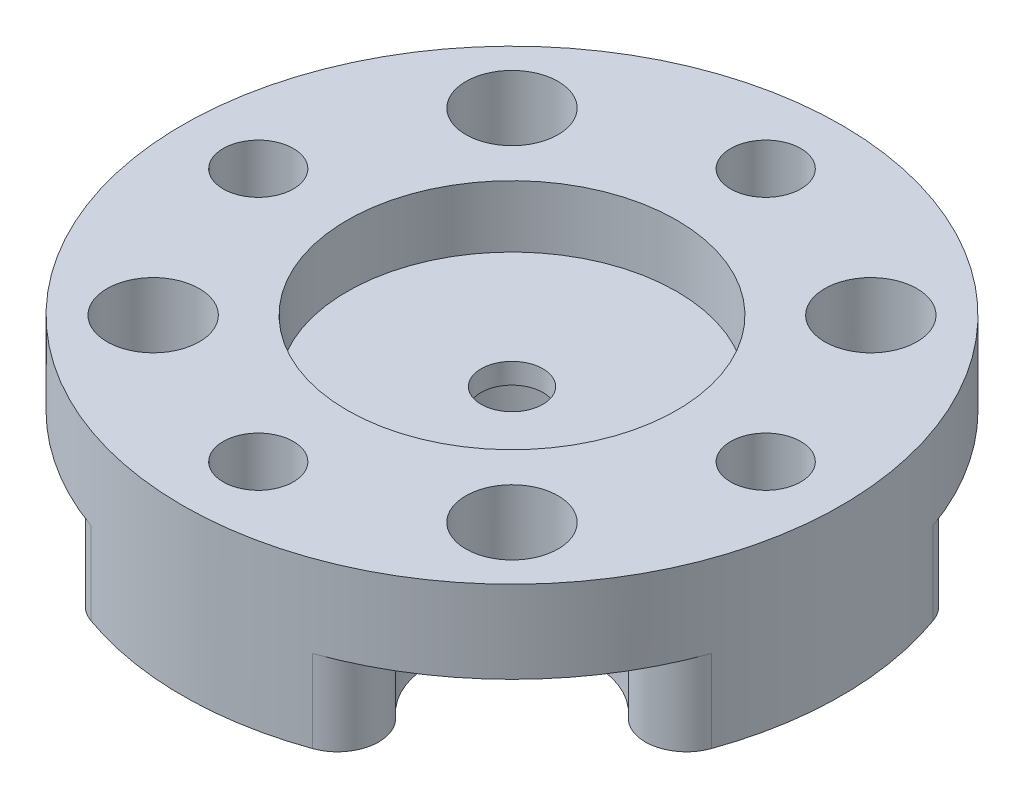
ISO-10303-21;
HEADER;
FILE_DESCRIPTION(('STEP AP214'),'2;1');
FILE_NAME('part.step','',(''),(''),'','','');
FILE_SCHEMA(('AUTOMOTIVE_DESIGN { 1 0 10303 214 1 1 1 1 }'));
ENDSEC;
DATA;
#1=APPLICATION_CONTEXT('core data for automotive mechanical design processes');
#2=APPLICATION_PROTOCOL_DEFINITION('international standard','automotive_design',2000,#1);
#3=PRODUCT_CONTEXT('',#1,'mechanical');
#4=PRODUCT('Part','Part','',(#3));
#5=PRODUCT_RELATED_PRODUCT_CATEGORY('part','',(#4));
#6=PRODUCT_DEFINITION_FORMATION('','',#4);
#7=PRODUCT_DEFINITION_CONTEXT('part definition',#1,'design');
#8=PRODUCT_DEFINITION('design','',#6,#7);
#9=PRODUCT_DEFINITION_SHAPE('','',#8);
#10=(LENGTH_UNIT() NAMED_UNIT(*) SI_UNIT(.MILLI.,.METRE.));
#11=(NAMED_UNIT(*) PLANE_ANGLE_UNIT() SI_UNIT($,.RADIAN.));
#12=(NAMED_UNIT(*) SI_UNIT($,.STERADIAN.) SOLID_ANGLE_UNIT());
#13=UNCERTAINTY_MEASURE_WITH_UNIT(LENGTH_MEASURE(1.E-05),#10,'distance_accuracy_value','');
#14=(GEOMETRIC_REPRESENTATION_CONTEXT(3) GLOBAL_UNCERTAINTY_ASSIGNED_CONTEXT((#13)) GLOBAL_UNIT_ASSIGNED_CONTEXT((#10,
#11,#12)) REPRESENTATION_CONTEXT('',''));
#15=CARTESIAN_POINT('',(0.,0.,0.));
#16=DIRECTION('',(0.,0.,1.));
#17=DIRECTION('',(1.,0.,0.));
#18=AXIS2_PLACEMENT_3D('',#15,#16,#17);
#19=CARTESIAN_POINT('',(-6.91479721322316,0.,6.91479721322334));
#20=DIRECTION('',(0.,1.,0.));
#21=DIRECTION('',(0.,0.,1.));
#22=AXIS2_PLACEMENT_3D('',#19,#20,#21);
#23=CYLINDRICAL_SURFACE('',#22,1.778);
#24=CARTESIAN_POINT('',(-6.91479721322316,6.35,6.91479721322334));
#25=DIRECTION('',(0.,1.,0.));
#26=DIRECTION('',(-1.,0.,0.));
#27=AXIS2_PLACEMENT_3D('',#24,#25,#26);
#28=CIRCLE('',#27,1.778);
#29=CARTESIAN_POINT('',(-8.69279721322316,6.35,6.91479721322335));
#30=VERTEX_POINT('',#29);
#31=EDGE_CURVE('E359',#30,#30,#28,.T.);
#32=ORIENTED_EDGE('',*,*,#31,.T.);
#33=EDGE_LOOP('',(#32));
#34=FACE_BOUND('',#33,.T.);
#35=CARTESIAN_POINT('',(-6.91479721322316,3.175,6.91479721322334));
#36=DIRECTION('',(0.,-1.,0.));
#37=DIRECTION('',(0.,0.,-1.));
#38=AXIS2_PLACEMENT_3D('',#35,#36,#37);
#39=CIRCLE('',#38,1.778);
#40=CARTESIAN_POINT('',(-6.91479721322316,3.175,5.13679721322334));
#41=VERTEX_POINT('',#40);
#42=EDGE_CURVE('E210',#41,#41,#39,.F.);
#43=ORIENTED_EDGE('',*,*,#42,.F.);
#44=EDGE_LOOP('',(#43));
#45=FACE_BOUND('',#44,.T.);
#46=ADVANCED_FACE('F37',(#34,#45),#23,.F.);
#47=CARTESIAN_POINT('',(-6.91479721322326,0.,-6.91479721322323));
#48=DIRECTION('',(0.,1.,0.));
#49=DIRECTION('',(0.,0.,1.));
#50=AXIS2_PLACEMENT_3D('',#47,#48,#49);
#51=CYLINDRICAL_SURFACE('',#50,1.778);
#52=CARTESIAN_POINT('',(-6.91479721322326,6.35,-6.91479721322323));
#53=DIRECTION('',(0.,1.,0.));
#54=DIRECTION('',(0.,0.,-1.));
#55=AXIS2_PLACEMENT_3D('',#52,#53,#54);
#56=CIRCLE('',#55,1.778);
#57=CARTESIAN_POINT('',(-6.91479721322326,6.35,-8.69279721322324));
#58=VERTEX_POINT('',#57);
#59=EDGE_CURVE('E362',#58,#58,#56,.T.);
#60=ORIENTED_EDGE('',*,*,#59,.T.);
#61=EDGE_LOOP('',(#60));
#62=FACE_BOUND('',#61,.T.);
#63=CARTESIAN_POINT('',(-6.91479721322326,3.175,-6.91479721322323));
#64=DIRECTION('',(0.,-1.,0.));
#65=DIRECTION('',(0.,0.,-1.));
#66=AXIS2_PLACEMENT_3D('',#63,#64,#65);
#67=CIRCLE('',#66,1.778);
#68=CARTESIAN_POINT('',(-6.91479721322326,3.175,-8.69279721322324));
#69=VERTEX_POINT('',#68);
#70=EDGE_CURVE('E206',#69,#69,#67,.F.);
#71=ORIENTED_EDGE('',*,*,#70,.F.);
#72=EDGE_LOOP('',(#71));
#73=FACE_BOUND('',#72,.T.);
#74=ADVANCED_FACE('F406',(#62,#73),#51,.F.);
#75=CARTESIAN_POINT('',(6.91479721322321,0.,-6.91479721322329));
#76=DIRECTION('',(0.,1.,0.));
#77=DIRECTION('',(0.,0.,1.));
#78=AXIS2_PLACEMENT_3D('',#75,#76,#77);
#79=CYLINDRICAL_SURFACE('',#78,1.778);
#80=CARTESIAN_POINT('',(6.91479721322321,6.35,-6.91479721322329));
#81=DIRECTION('',(0.,1.,0.));
#82=DIRECTION('',(1.,0.,0.));
#83=AXIS2_PLACEMENT_3D('',#80,#81,#82);
#84=CIRCLE('',#83,1.778);
#85=CARTESIAN_POINT('',(8.69279721322321,6.35,-6.91479721322329));
#86=VERTEX_POINT('',#85);
#87=EDGE_CURVE('E365',#86,#86,#84,.T.);
#88=ORIENTED_EDGE('',*,*,#87,.T.);
#89=EDGE_LOOP('',(#88));
#90=FACE_BOUND('',#89,.T.);
#91=CARTESIAN_POINT('',(6.91479721322321,3.175,-6.91479721322329));
#92=DIRECTION('',(0.,-1.,0.));
#93=DIRECTION('',(0.,0.,-1.));
#94=AXIS2_PLACEMENT_3D('',#91,#92,#93);
#95=CIRCLE('',#94,1.778);
#96=CARTESIAN_POINT('',(6.91479721322321,3.175,-8.69279721322329));
#97=VERTEX_POINT('',#96);
#98=EDGE_CURVE('E201',#97,#97,#95,.F.);
#99=ORIENTED_EDGE('',*,*,#98,.F.);
#100=EDGE_LOOP('',(#99));
#101=FACE_BOUND('',#100,.T.);
#102=ADVANCED_FACE('F412',(#90,#101),#79,.F.);
#103=CARTESIAN_POINT('',(6.91479721322326,0.,6.91479721322323));
#104=DIRECTION('',(0.,1.,0.));
#105=DIRECTION('',(0.,0.,1.));
#106=AXIS2_PLACEMENT_3D('',#103,#104,#105);
#107=CYLINDRICAL_SURFACE('',#106,1.778);
#108=CARTESIAN_POINT('',(6.91479721322326,6.35,6.91479721322323));
#109=DIRECTION('',(0.,1.,0.));
#110=DIRECTION('',(0.,0.,1.));
#111=AXIS2_PLACEMENT_3D('',#108,#109,#110);
#112=CIRCLE('',#111,1.778);
#113=CARTESIAN_POINT('',(6.91479721322326,6.35,8.69279721322324));
#114=VERTEX_POINT('',#113);
#115=EDGE_CURVE('E289',#114,#114,#112,.T.);
#116=ORIENTED_EDGE('',*,*,#115,.T.);
#117=EDGE_LOOP('',(#116));
#118=FACE_BOUND('',#117,.T.);
#119=CARTESIAN_POINT('',(6.91479721322326,3.175,6.91479721322323));
#120=DIRECTION('',(0.,-1.,0.));
#121=DIRECTION('',(0.,0.,-1.));
#122=AXIS2_PLACEMENT_3D('',#119,#120,#121);
#123=CIRCLE('',#122,1.778);
#124=CARTESIAN_POINT('',(6.91479721322326,3.175,5.13679721322323));
#125=VERTEX_POINT('',#124);
#126=EDGE_CURVE('E196',#125,#125,#123,.F.);
#127=ORIENTED_EDGE('',*,*,#126,.F.);
#128=EDGE_LOOP('',(#127));
#129=FACE_BOUND('',#128,.T.);
#130=ADVANCED_FACE('F421',(#118,#129),#107,.F.);
#131=CARTESIAN_POINT('',(0.,6.35,0.));
#132=DIRECTION('',(0.,-1.,0.));
#133=DIRECTION('',(0.,0.,-1.));
#134=AXIS2_PLACEMENT_3D('',#131,#132,#133);
#135=CYLINDRICAL_SURFACE('',#134,12.7);
#136=CARTESIAN_POINT('',(0.,3.175,0.));
#137=DIRECTION('',(0.,-1.,0.));
#138=DIRECTION('',(0.,0.,-1.));
#139=AXIS2_PLACEMENT_3D('',#136,#137,#138);
#140=CIRCLE('',#139,12.7);
#141=CARTESIAN_POINT('',(11.9592831816571,3.175,4.27382098138569));
#142=VERTEX_POINT('',#141);
#143=CARTESIAN_POINT('',(4.27382098138574,3.175,11.9592831816571));
#144=VERTEX_POINT('',#143);
#145=EDGE_CURVE('E199',#142,#144,#140,.T.);
#146=ORIENTED_EDGE('',*,*,#145,.F.);
#147=DIRECTION('',(0.,-1.,0.));
#148=VECTOR('',#147,1.);
#149=CARTESIAN_POINT('',(11.9592831816571,6.35,4.27382098138569));
#150=LINE('',#149,#148);
#151=CARTESIAN_POINT('',(11.9592831816571,0.,4.27382098138569));
#152=VERTEX_POINT('',#151);
#153=EDGE_CURVE('E229',#142,#152,#150,.T.);
#154=ORIENTED_EDGE('',*,*,#153,.T.);
#155=CARTESIAN_POINT('',(0.,0.,0.));
#156=DIRECTION('',(0.,1.,0.));
#157=DIRECTION('',(0.,0.,1.));
#158=AXIS2_PLACEMENT_3D('',#155,#156,#157);
#159=CIRCLE('',#158,12.7);
#160=CARTESIAN_POINT('',(11.9592831816571,0.,-4.27382098138578));
#161=VERTEX_POINT('',#160);
#162=EDGE_CURVE('E184',#152,#161,#159,.T.);
#163=ORIENTED_EDGE('',*,*,#162,.T.);
#164=DIRECTION('',(0.,-1.,0.));
#165=VECTOR('',#164,1.);
#166=CARTESIAN_POINT('',(11.9592831816571,6.35,-4.27382098138578));
#167=LINE('',#166,#165);
#168=CARTESIAN_POINT('',(11.9592831816571,3.175,-4.27382098138578));
#169=VERTEX_POINT('',#168);
#170=EDGE_CURVE('E223',#161,#169,#167,.F.);
#171=ORIENTED_EDGE('',*,*,#170,.T.);
#172=CARTESIAN_POINT('',(0.,3.175,0.));
#173=DIRECTION('',(0.,-1.,0.));
#174=DIRECTION('',(0.,0.,-1.));
#175=AXIS2_PLACEMENT_3D('',#172,#173,#174);
#176=CIRCLE('',#175,12.7);
#177=CARTESIAN_POINT('',(4.27382098138565,3.175,-11.9592831816572));
#178=VERTEX_POINT('',#177);
#179=EDGE_CURVE('E204',#178,#169,#176,.T.);
#180=ORIENTED_EDGE('',*,*,#179,.F.);
#181=DIRECTION('',(0.,-1.,0.));
#182=VECTOR('',#181,1.);
#183=CARTESIAN_POINT('',(4.27382098138565,6.35,-11.9592831816572));
#184=LINE('',#183,#182);
#185=CARTESIAN_POINT('',(4.27382098138565,0.,-11.9592831816572));
#186=VERTEX_POINT('',#185);
#187=EDGE_CURVE('E172',#178,#186,#184,.T.);
#188=ORIENTED_EDGE('',*,*,#187,.T.);
#189=CARTESIAN_POINT('',(-4.27382098138574,0.,-11.9592831816571));
#190=VERTEX_POINT('',#189);
#191=EDGE_CURVE('E180',#186,#190,#159,.T.);
#192=ORIENTED_EDGE('',*,*,#191,.T.);
#193=DIRECTION('',(0.,-1.,0.));
#194=VECTOR('',#193,1.);
#195=CARTESIAN_POINT('',(-4.27382098138574,6.35,-11.9592831816571));
#196=LINE('',#195,#194);
#197=CARTESIAN_POINT('',(-4.27382098138574,3.175,-11.9592831816571));
#198=VERTEX_POINT('',#197);
#199=EDGE_CURVE('E173',#190,#198,#196,.F.);
#200=ORIENTED_EDGE('',*,*,#199,.T.);
#201=CARTESIAN_POINT('',(0.,3.175,0.));
#202=DIRECTION('',(0.,-1.,0.));
#203=DIRECTION('',(0.,0.,-1.));
#204=AXIS2_PLACEMENT_3D('',#201,#202,#203);
#205=CIRCLE('',#204,12.7);
#206=CARTESIAN_POINT('',(-11.9592831816571,3.175,-4.27382098138569));
#207=VERTEX_POINT('',#206);
#208=EDGE_CURVE('E170',#207,#198,#205,.T.);
#209=ORIENTED_EDGE('',*,*,#208,.F.);
#210=DIRECTION('',(0.,-1.,0.));
#211=VECTOR('',#210,1.);
#212=CARTESIAN_POINT('',(-11.9592831816571,6.35,-4.27382098138569));
#213=LINE('',#212,#211);
#214=CARTESIAN_POINT('',(-11.9592831816571,0.,-4.27382098138569));
#215=VERTEX_POINT('',#214);
#216=EDGE_CURVE('E153',#207,#215,#213,.T.);
#217=ORIENTED_EDGE('',*,*,#216,.T.);
#218=CARTESIAN_POINT('',(-11.9592831816571,0.,4.27382098138586));
#219=VERTEX_POINT('',#218);
#220=EDGE_CURVE('E167',#215,#219,#159,.T.);
#221=ORIENTED_EDGE('',*,*,#220,.T.);
#222=DIRECTION('',(0.,-1.,0.));
#223=VECTOR('',#222,1.);
#224=CARTESIAN_POINT('',(-11.9592831816571,6.35,4.27382098138586));
#225=LINE('',#224,#223);
#226=CARTESIAN_POINT('',(-11.9592831816571,3.175,4.27382098138586));
#227=VERTEX_POINT('',#226);
#228=EDGE_CURVE('E215',#219,#227,#225,.F.);
#229=ORIENTED_EDGE('',*,*,#228,.T.);
#230=CARTESIAN_POINT('',(0.,3.175,0.));
#231=DIRECTION('',(0.,-1.,0.));
#232=DIRECTION('',(0.,0.,-1.));
#233=AXIS2_PLACEMENT_3D('',#230,#231,#232);
#234=CIRCLE('',#233,12.7);
#235=CARTESIAN_POINT('',(-4.27382098138556,3.175,11.9592831816572));
#236=VERTEX_POINT('',#235);
#237=EDGE_CURVE('E213',#236,#227,#234,.T.);
#238=ORIENTED_EDGE('',*,*,#237,.F.);
#239=DIRECTION('',(0.,-1.,0.));
#240=VECTOR('',#239,1.);
#241=CARTESIAN_POINT('',(-4.27382098138556,6.35,11.9592831816572));
#242=LINE('',#241,#240);
#243=CARTESIAN_POINT('',(-4.27382098138556,0.,11.9592831816572));
#244=VERTEX_POINT('',#243);
#245=EDGE_CURVE('E217',#236,#244,#242,.T.);
#246=ORIENTED_EDGE('',*,*,#245,.T.);
#247=CARTESIAN_POINT('',(4.27382098138574,0.,11.9592831816571));
#248=VERTEX_POINT('',#247);
#249=EDGE_CURVE('E181',#244,#248,#159,.T.);
#250=ORIENTED_EDGE('',*,*,#249,.T.);
#251=DIRECTION('',(0.,-1.,0.));
#252=VECTOR('',#251,1.);
#253=CARTESIAN_POINT('',(4.27382098138574,6.35,11.9592831816571));
#254=LINE('',#253,#252);
#255=EDGE_CURVE('E226',#248,#144,#254,.F.);
#256=ORIENTED_EDGE('',*,*,#255,.T.);
#257=EDGE_LOOP('',(#146,#154,#163,#171,#180,#188,#192,#200,#209,#217,#221,#229,#238,#246,#250,#256));
#258=FACE_BOUND('',#257,.T.);
#259=CARTESIAN_POINT('',(0.,6.35,0.));
#260=DIRECTION('',(0.,1.,0.));
#261=DIRECTION('',(0.,0.,1.));
#262=AXIS2_PLACEMENT_3D('',#259,#260,#261);
#263=CIRCLE('',#262,12.7);
#264=CARTESIAN_POINT('',(0.,6.35,12.7));
#265=VERTEX_POINT('',#264);
#266=EDGE_CURVE('E189',#265,#265,#263,.T.);
#267=ORIENTED_EDGE('',*,*,#266,.F.);
#268=EDGE_LOOP('',(#267));
#269=FACE_BOUND('',#268,.T.);
#270=ADVANCED_FACE('F164',(#258,#269),#135,.T.);
#271=CARTESIAN_POINT('',(0.,6.35,0.));
#272=DIRECTION('',(0.,1.,0.));
#273=DIRECTION('',(0.,0.,1.));
#274=AXIS2_PLACEMENT_3D('',#271,#272,#273);
#275=PLANE('',#274);
#276=ORIENTED_EDGE('',*,*,#31,.F.);
#277=EDGE_LOOP('',(#276));
#278=FACE_BOUND('',#277,.T.);
#279=ORIENTED_EDGE('',*,*,#59,.F.);
#280=EDGE_LOOP('',(#279));
#281=FACE_BOUND('',#280,.T.);
#282=ORIENTED_EDGE('',*,*,#87,.F.);
#283=EDGE_LOOP('',(#282));
#284=FACE_BOUND('',#283,.T.);
#285=CARTESIAN_POINT('',(-1.03627170142527E-13,6.35,-9.779));
#286=DIRECTION('',(0.,1.,0.));
#287=DIRECTION('',(0.,0.,1.));
#288=AXIS2_PLACEMENT_3D('',#285,#286,#287);
#289=CIRCLE('',#288,1.35254999999999);
#290=CARTESIAN_POINT('',(-1.03627170142527E-13,6.35,-8.42645000000001));
#291=VERTEX_POINT('',#290);
#292=EDGE_CURVE('E368',#291,#291,#289,.T.);
#293=ORIENTED_EDGE('',*,*,#292,.F.);
#294=EDGE_LOOP('',(#293));
#295=FACE_BOUND('',#294,.T.);
#296=CARTESIAN_POINT('',(9.779,6.35,0.));
#297=DIRECTION('',(0.,1.,0.));
#298=DIRECTION('',(0.,0.,1.));
#299=AXIS2_PLACEMENT_3D('',#296,#297,#298);
#300=CIRCLE('',#299,1.35254999999999);
#301=CARTESIAN_POINT('',(9.779,6.35,1.35254999999999));
#302=VERTEX_POINT('',#301);
#303=EDGE_CURVE('E374',#302,#302,#300,.T.);
#304=ORIENTED_EDGE('',*,*,#303,.F.);
#305=EDGE_LOOP('',(#304));
#306=FACE_BOUND('',#305,.T.);
#307=CARTESIAN_POINT('',(0.,6.35,9.779));
#308=DIRECTION('',(0.,1.,0.));
#309=DIRECTION('',(0.,0.,1.));
#310=AXIS2_PLACEMENT_3D('',#307,#308,#309);
#311=CIRCLE('',#310,1.35254999999999);
#312=CARTESIAN_POINT('',(0.,6.35,11.13155));
#313=VERTEX_POINT('',#312);
#314=EDGE_CURVE('E304',#313,#313,#311,.T.);
#315=ORIENTED_EDGE('',*,*,#314,.F.);
#316=EDGE_LOOP('',(#315));
#317=FACE_BOUND('',#316,.T.);
#318=ORIENTED_EDGE('',*,*,#115,.F.);
#319=EDGE_LOOP('',(#318));
#320=FACE_BOUND('',#319,.T.);
#321=CARTESIAN_POINT('',(-9.779,6.35,0.));
#322=DIRECTION('',(0.,1.,0.));
#323=DIRECTION('',(0.,0.,1.));
#324=AXIS2_PLACEMENT_3D('',#321,#322,#323);
#325=CIRCLE('',#324,1.35254999999999);
#326=CARTESIAN_POINT('',(-9.779,6.35,1.35254999999999));
#327=VERTEX_POINT('',#326);
#328=EDGE_CURVE('E309',#327,#327,#325,.T.);
#329=ORIENTED_EDGE('',*,*,#328,.F.);
#330=EDGE_LOOP('',(#329));
#331=FACE_BOUND('',#330,.T.);
#332=CARTESIAN_POINT('',(0.,6.35,0.));
#333=DIRECTION('',(0.,1.,0.));
#334=DIRECTION('',(0.,0.,1.));
#335=AXIS2_PLACEMENT_3D('',#332,#333,#334);
#336=CIRCLE('',#335,6.35);
#337=CARTESIAN_POINT('',(0.,6.35,6.35));
#338=VERTEX_POINT('',#337);
#339=EDGE_CURVE('E320',#338,#338,#336,.T.);
#340=ORIENTED_EDGE('',*,*,#339,.F.);
#341=EDGE_LOOP('',(#340));
#342=FACE_BOUND('',#341,.T.);
#343=ORIENTED_EDGE('',*,*,#266,.T.);
#344=EDGE_LOOP('',(#343));
#345=FACE_BOUND('',#344,.T.);
#346=ADVANCED_FACE('F329',(#278,#281,#284,#295,#306,#317,#320,#331,#342,#345),#275,.T.);
#347=CARTESIAN_POINT('',(0.,0.,0.));
#348=DIRECTION('',(0.,1.,0.));
#349=DIRECTION('',(0.,0.,1.));
#350=AXIS2_PLACEMENT_3D('',#347,#348,#349);
#351=PLANE('',#350);
#352=CARTESIAN_POINT('',(-1.03627170142527E-13,0.,-9.779));
#353=DIRECTION('',(0.,1.,0.));
#354=DIRECTION('',(0.,0.,1.));
#355=AXIS2_PLACEMENT_3D('',#352,#353,#354);
#356=CIRCLE('',#355,1.35255);
#357=CARTESIAN_POINT('',(-1.03627170142527E-13,0.,-8.42645));
#358=VERTEX_POINT('',#357);
#359=EDGE_CURVE('E371',#358,#358,#356,.T.);
#360=ORIENTED_EDGE('',*,*,#359,.T.);
#361=EDGE_LOOP('',(#360));
#362=FACE_BOUND('',#361,.T.);
#363=CARTESIAN_POINT('',(9.779,0.,0.));
#364=DIRECTION('',(0.,1.,0.));
#365=DIRECTION('',(0.,0.,1.));
#366=AXIS2_PLACEMENT_3D('',#363,#364,#365);
#367=CIRCLE('',#366,1.35255);
#368=CARTESIAN_POINT('',(9.779,0.,1.35255));
#369=VERTEX_POINT('',#368);
#370=EDGE_CURVE('E377',#369,#369,#367,.T.);
#371=ORIENTED_EDGE('',*,*,#370,.T.);
#372=EDGE_LOOP('',(#371));
#373=FACE_BOUND('',#372,.T.);
#374=CARTESIAN_POINT('',(0.,0.,9.779));
#375=DIRECTION('',(0.,1.,0.));
#376=DIRECTION('',(0.,0.,1.));
#377=AXIS2_PLACEMENT_3D('',#374,#375,#376);
#378=CIRCLE('',#377,1.35255);
#379=CARTESIAN_POINT('',(0.,0.,11.13155));
#380=VERTEX_POINT('',#379);
#381=EDGE_CURVE('E300',#380,#380,#378,.T.);
#382=ORIENTED_EDGE('',*,*,#381,.T.);
#383=EDGE_LOOP('',(#382));
#384=FACE_BOUND('',#383,.T.);
#385=CARTESIAN_POINT('',(-9.779,0.,0.));
#386=DIRECTION('',(0.,1.,0.));
#387=DIRECTION('',(0.,0.,1.));
#388=AXIS2_PLACEMENT_3D('',#385,#386,#387);
#389=CIRCLE('',#388,1.35255);
#390=CARTESIAN_POINT('',(-9.779,0.,1.35255));
#391=VERTEX_POINT('',#390);
#392=EDGE_CURVE('E312',#391,#391,#389,.T.);
#393=ORIENTED_EDGE('',*,*,#392,.T.);
#394=EDGE_LOOP('',(#393));
#395=FACE_BOUND('',#394,.T.);
#396=CARTESIAN_POINT('',(0.,0.,0.));
#397=DIRECTION('',(0.,-1.,0.));
#398=DIRECTION('',(0.,0.,-1.));
#399=AXIS2_PLACEMENT_3D('',#396,#397,#398);
#400=CIRCLE('',#399,3.1115);
#401=CARTESIAN_POINT('',(0.,0.,-3.1115));
#402=VERTEX_POINT('',#401);
#403=EDGE_CURVE('E194',#402,#402,#400,.T.);
#404=ORIENTED_EDGE('',*,*,#403,.F.);
#405=EDGE_LOOP('',(#404));
#406=FACE_BOUND('',#405,.T.);
#407=ORIENTED_EDGE('',*,*,#162,.F.);
#408=CARTESIAN_POINT('',(10.46437278395,0.,3.73959335871248));
#409=DIRECTION('',(0.,1.,0.));
#410=DIRECTION('',(0.,0.,1.));
#411=AXIS2_PLACEMENT_3D('',#408,#409,#410);
#412=CIRCLE('',#411,1.5875);
#413=CARTESIAN_POINT('',(9.28118092704109,0.,4.7979946435494));
#414=VERTEX_POINT('',#413);
#415=EDGE_CURVE('E241',#152,#414,#412,.F.);
#416=ORIENTED_EDGE('',*,*,#415,.T.);
#417=CARTESIAN_POINT('',(6.91479721322326,0.,6.91479721322323));
#418=DIRECTION('',(0.,-1.,0.));
#419=DIRECTION('',(0.,0.,-1.));
#420=AXIS2_PLACEMENT_3D('',#417,#418,#419);
#421=CIRCLE('',#420,3.175);
#422=CARTESIAN_POINT('',(4.79799464354943,0.,9.28118092704107));
#423=VERTEX_POINT('',#422);
#424=EDGE_CURVE('E281',#423,#414,#421,.T.);
#425=ORIENTED_EDGE('',*,*,#424,.F.);
#426=CARTESIAN_POINT('',(3.73959335871252,0.,10.46437278395));
#427=DIRECTION('',(0.,1.,0.));
#428=DIRECTION('',(0.,0.,1.));
#429=AXIS2_PLACEMENT_3D('',#426,#427,#428);
#430=CIRCLE('',#429,1.5875);
#431=EDGE_CURVE('E239',#423,#248,#430,.F.);
#432=ORIENTED_EDGE('',*,*,#431,.T.);
#433=ORIENTED_EDGE('',*,*,#249,.F.);
#434=CARTESIAN_POINT('',(-3.73959335871237,0.,10.46437278395));
#435=DIRECTION('',(0.,1.,0.));
#436=DIRECTION('',(0.,0.,1.));
#437=AXIS2_PLACEMENT_3D('',#434,#435,#436);
#438=CIRCLE('',#437,1.5875);
#439=CARTESIAN_POINT('',(-4.7979946435493,0.,9.28118092704114));
#440=VERTEX_POINT('',#439);
#441=EDGE_CURVE('E233',#244,#440,#438,.F.);
#442=ORIENTED_EDGE('',*,*,#441,.T.);
#443=CARTESIAN_POINT('',(-6.91479721322316,0.,6.91479721322334));
#444=DIRECTION('',(0.,-1.,0.));
#445=DIRECTION('',(1.,0.,0.));
#446=AXIS2_PLACEMENT_3D('',#443,#444,#445);
#447=CIRCLE('',#446,3.175);
#448=CARTESIAN_POINT('',(-9.28118092704102,0.,4.79799464354953));
#449=VERTEX_POINT('',#448);
#450=EDGE_CURVE('E472',#449,#440,#447,.T.);
#451=ORIENTED_EDGE('',*,*,#450,.F.);
#452=CARTESIAN_POINT('',(-10.4643727839499,0.,3.73959335871263));
#453=DIRECTION('',(0.,1.,0.));
#454=DIRECTION('',(0.,0.,1.));
#455=AXIS2_PLACEMENT_3D('',#452,#453,#454);
#456=CIRCLE('',#455,1.5875);
#457=EDGE_CURVE('E179',#449,#219,#456,.F.);
#458=ORIENTED_EDGE('',*,*,#457,.T.);
#459=ORIENTED_EDGE('',*,*,#220,.F.);
#460=CARTESIAN_POINT('',(-10.46437278395,0.,-3.73959335871248));
#461=DIRECTION('',(0.,1.,0.));
#462=DIRECTION('',(0.,0.,1.));
#463=AXIS2_PLACEMENT_3D('',#460,#461,#462);
#464=CIRCLE('',#463,1.5875);
#465=CARTESIAN_POINT('',(-9.28118092704109,0.,-4.7979946435494));
#466=VERTEX_POINT('',#465);
#467=EDGE_CURVE('E149',#215,#466,#464,.F.);
#468=ORIENTED_EDGE('',*,*,#467,.T.);
#469=CARTESIAN_POINT('',(-6.91479721322326,0.,-6.91479721322323));
#470=DIRECTION('',(0.,-1.,0.));
#471=DIRECTION('',(0.,0.,1.));
#472=AXIS2_PLACEMENT_3D('',#469,#470,#471);
#473=CIRCLE('',#472,3.175);
#474=CARTESIAN_POINT('',(-4.79799464354943,0.,-9.28118092704107));
#475=VERTEX_POINT('',#474);
#476=EDGE_CURVE('E477',#475,#466,#473,.T.);
#477=ORIENTED_EDGE('',*,*,#476,.F.);
#478=CARTESIAN_POINT('',(-3.73959335871252,0.,-10.46437278395));
#479=DIRECTION('',(0.,1.,0.));
#480=DIRECTION('',(0.,0.,1.));
#481=AXIS2_PLACEMENT_3D('',#478,#479,#480);
#482=CIRCLE('',#481,1.5875);
#483=EDGE_CURVE('E160',#475,#190,#482,.F.);
#484=ORIENTED_EDGE('',*,*,#483,.T.);
#485=ORIENTED_EDGE('',*,*,#191,.F.);
#486=CARTESIAN_POINT('',(3.73959335871244,0.,-10.46437278395));
#487=DIRECTION('',(0.,1.,0.));
#488=DIRECTION('',(0.,0.,1.));
#489=AXIS2_PLACEMENT_3D('',#486,#487,#488);
#490=CIRCLE('',#489,1.5875);
#491=CARTESIAN_POINT('',(4.79799464354937,0.,-9.28118092704111));
#492=VERTEX_POINT('',#491);
#493=EDGE_CURVE('E159',#186,#492,#490,.F.);
#494=ORIENTED_EDGE('',*,*,#493,.T.);
#495=CARTESIAN_POINT('',(6.91479721322321,0.,-6.91479721322329));
#496=DIRECTION('',(0.,-1.,0.));
#497=DIRECTION('',(-1.,0.,0.));
#498=AXIS2_PLACEMENT_3D('',#495,#496,#497);
#499=CIRCLE('',#498,3.175);
#500=CARTESIAN_POINT('',(9.28118092704105,0.,-4.79799464354947));
#501=VERTEX_POINT('',#500);
#502=EDGE_CURVE('E352',#501,#492,#499,.T.);
#503=ORIENTED_EDGE('',*,*,#502,.F.);
#504=CARTESIAN_POINT('',(10.46437278395,0.,-3.73959335871256));
#505=DIRECTION('',(0.,1.,0.));
#506=DIRECTION('',(0.,0.,1.));
#507=AXIS2_PLACEMENT_3D('',#504,#505,#506);
#508=CIRCLE('',#507,1.5875);
#509=EDGE_CURVE('E237',#501,#161,#508,.F.);
#510=ORIENTED_EDGE('',*,*,#509,.T.);
#511=EDGE_LOOP('',(#407,#416,#425,#432,#433,#442,#451,#458,#459,#468,#477,#484,#485,#494,#503,#510));
#512=FACE_BOUND('',#511,.T.);
#513=ADVANCED_FACE('F176',(#362,#373,#384,#395,#406,#512),#351,.F.);
#514=CARTESIAN_POINT('',(0.,3.96875,0.));
#515=DIRECTION('',(0.,1.,0.));
#516=DIRECTION('',(0.,0.,1.));
#517=AXIS2_PLACEMENT_3D('',#514,#515,#516);
#518=CYLINDRICAL_SURFACE('',#517,6.35);
#519=CARTESIAN_POINT('',(0.,3.96875,0.));
#520=DIRECTION('',(0.,1.,0.));
#521=DIRECTION('',(0.,0.,1.));
#522=AXIS2_PLACEMENT_3D('',#519,#520,#521);
#523=CIRCLE('',#522,6.35);
#524=CARTESIAN_POINT('',(0.,3.96875,6.35));
#525=VERTEX_POINT('',#524);
#526=EDGE_CURVE('E186',#525,#525,#523,.T.);
#527=CARTESIAN_POINT('',(0.,3.96875,6.35));
#528=CARTESIAN_POINT('',(0.,3.9935546875,6.35));
#529=CARTESIAN_POINT('',(0.,4.018359375,6.35));
#530=CARTESIAN_POINT('',(0.,4.06796875,6.35));
#531=CARTESIAN_POINT('',(0.,4.0927734375,6.35));
#532=CARTESIAN_POINT('',(0.,4.1423828125,6.35));
#533=CARTESIAN_POINT('',(0.,4.1671875,6.35));
#534=CARTESIAN_POINT('',(0.,4.216796875,6.35));
#535=CARTESIAN_POINT('',(0.,4.2416015625,6.35));
#536=CARTESIAN_POINT('',(0.,4.2912109375,6.35));
#537=CARTESIAN_POINT('',(0.,4.316015625,6.35));
#538=CARTESIAN_POINT('',(0.,4.365625,6.35));
#539=CARTESIAN_POINT('',(0.,4.3904296875,6.35));
#540=CARTESIAN_POINT('',(0.,4.4400390625,6.35));
#541=CARTESIAN_POINT('',(0.,4.46484375,6.35));
#542=CARTESIAN_POINT('',(0.,4.514453125,6.35));
#543=CARTESIAN_POINT('',(0.,4.5392578125,6.35));
#544=CARTESIAN_POINT('',(0.,4.5888671875,6.35));
#545=CARTESIAN_POINT('',(0.,4.613671875,6.35));
#546=CARTESIAN_POINT('',(0.,4.66328125,6.35));
#547=CARTESIAN_POINT('',(0.,4.6880859375,6.35));
#548=CARTESIAN_POINT('',(0.,4.7376953125,6.35));
#549=CARTESIAN_POINT('',(0.,4.7625,6.35));
#550=CARTESIAN_POINT('',(0.,4.812109375,6.35));
#551=CARTESIAN_POINT('',(0.,4.8369140625,6.35));
#552=CARTESIAN_POINT('',(0.,4.8865234375,6.35));
#553=CARTESIAN_POINT('',(0.,4.911328125,6.35));
#554=CARTESIAN_POINT('',(0.,4.9609375,6.35));
#555=CARTESIAN_POINT('',(0.,4.9857421875,6.35));
#556=CARTESIAN_POINT('',(0.,5.0353515625,6.35));
#557=CARTESIAN_POINT('',(0.,5.06015625,6.35));
#558=CARTESIAN_POINT('',(0.,5.109765625,6.35));
#559=CARTESIAN_POINT('',(0.,5.1345703125,6.35));
#560=CARTESIAN_POINT('',(0.,5.1841796875,6.35));
#561=CARTESIAN_POINT('',(0.,5.208984375,6.35));
#562=CARTESIAN_POINT('',(0.,5.25859375,6.35));
#563=CARTESIAN_POINT('',(0.,5.2833984375,6.35));
#564=CARTESIAN_POINT('',(0.,5.3330078125,6.35));
#565=CARTESIAN_POINT('',(0.,5.3578125,6.35));
#566=CARTESIAN_POINT('',(0.,5.407421875,6.35));
#567=CARTESIAN_POINT('',(0.,5.4322265625,6.35));
#568=CARTESIAN_POINT('',(0.,5.4818359375,6.35));
#569=CARTESIAN_POINT('',(0.,5.506640625,6.35));
#570=CARTESIAN_POINT('',(0.,5.55625,6.35));
#571=CARTESIAN_POINT('',(0.,5.5810546875,6.35));
#572=CARTESIAN_POINT('',(0.,5.6306640625,6.35));
#573=CARTESIAN_POINT('',(0.,5.65546875,6.35));
#574=CARTESIAN_POINT('',(0.,5.705078125,6.35));
#575=CARTESIAN_POINT('',(0.,5.7298828125,6.35));
#576=CARTESIAN_POINT('',(0.,5.7794921875,6.35));
#577=CARTESIAN_POINT('',(0.,5.804296875,6.35));
#578=CARTESIAN_POINT('',(0.,5.85390625,6.35));
#579=CARTESIAN_POINT('',(0.,5.8787109375,6.35));
#580=CARTESIAN_POINT('',(0.,5.9283203125,6.35));
#581=CARTESIAN_POINT('',(0.,5.953125,6.35));
#582=CARTESIAN_POINT('',(0.,6.002734375,6.35));
#583=CARTESIAN_POINT('',(0.,6.0275390625,6.35));
#584=CARTESIAN_POINT('',(0.,6.0771484375,6.35));
#585=CARTESIAN_POINT('',(0.,6.101953125,6.35));
#586=CARTESIAN_POINT('',(0.,6.1515625,6.35));
#587=CARTESIAN_POINT('',(0.,6.1763671875,6.35));
#588=CARTESIAN_POINT('',(0.,6.2259765625,6.35));
#589=CARTESIAN_POINT('',(0.,6.25078125,6.35));
#590=CARTESIAN_POINT('',(0.,6.300390625,6.35));
#591=CARTESIAN_POINT('',(0.,6.3251953125,6.35));
#592=CARTESIAN_POINT('',(0.,6.35,6.35));
#593=B_SPLINE_CURVE_WITH_KNOTS('',3,(#527,#528,#529,#530,#531,#532,#533,#534,#535,#536,#537,
#538,#539,#540,#541,#542,#543,#544,#545,#546,#547,#548,#549,#550,#551,#552,#553,#554,#555,#556,
#557,#558,#559,#560,#561,#562,#563,#564,#565,#566,#567,#568,#569,#570,#571,#572,#573,#574,#575,
#576,#577,#578,#579,#580,#581,#582,#583,#584,#585,#586,#587,#588,#589,#590,#591,#592),
.UNSPECIFIED.,.F.,.F.,(4,2,2,2,2,2,2,2,2,2,2,2,2,2,2,2,2,2,2,2,2,2,2,2,2,2,2,2,2,2,2,2,4),(0.,
0.0744140625,0.148828125,0.2232421875,0.29765625,0.3720703125,0.446484375,0.5208984375,
0.5953125,0.6697265625,0.744140625,0.8185546875,0.892968750000001,0.967382812500001,1.041796875,
1.1162109375,1.190625,1.2650390625,1.339453125,1.4138671875,1.48828125,1.5626953125,1.637109375,
1.7115234375,1.7859375,1.8603515625,1.934765625,2.0091796875,2.08359375,2.1580078125,
2.232421875,2.3068359375,2.38125),.UNSPECIFIED.);
#594=EDGE_CURVE('BSEAM327',#525,#338,#593,.T.);
#595=ORIENTED_EDGE('',*,*,#526,.F.);
#596=ORIENTED_EDGE('',*,*,#339,.T.);
#597=ORIENTED_EDGE('',*,*,#594,.T.);
#598=ORIENTED_EDGE('',*,*,#594,.F.);
#599=EDGE_LOOP('',(#595,#597,#596,#598));
#600=FACE_BOUND('',#599,.T.);
#601=ADVANCED_FACE('F327',(#600),#518,.F.);
#602=CARTESIAN_POINT('',(0.,3.96875,0.));
#603=DIRECTION('',(0.,1.,0.));
#604=DIRECTION('',(0.,0.,1.));
#605=AXIS2_PLACEMENT_3D('',#602,#603,#604);
#606=PLANE('',#605);
#607=CARTESIAN_POINT('',(0.,3.96875,0.));
#608=DIRECTION('',(0.,1.,0.));
#609=DIRECTION('',(0.,0.,1.));
#610=AXIS2_PLACEMENT_3D('',#607,#608,#609);
#611=CIRCLE('',#610,1.190625);
#612=CARTESIAN_POINT('',(0.,3.96875,1.190625));
#613=VERTEX_POINT('',#612);
#614=EDGE_CURVE('E195',#613,#613,#611,.T.);
#615=ORIENTED_EDGE('',*,*,#614,.F.);
#616=EDGE_LOOP('',(#615));
#617=FACE_BOUND('',#616,.T.);
#618=ORIENTED_EDGE('',*,*,#526,.T.);
#619=EDGE_LOOP('',(#618));
#620=FACE_BOUND('',#619,.T.);
#621=ADVANCED_FACE('F610',(#617,#620),#606,.T.);
#622=CARTESIAN_POINT('',(0.,3.175,0.));
#623=DIRECTION('',(0.,-1.,0.));
#624=DIRECTION('',(0.,0.,-1.));
#625=AXIS2_PLACEMENT_3D('',#622,#623,#624);
#626=CYLINDRICAL_SURFACE('',#625,3.1115);
#627=CARTESIAN_POINT('',(0.,3.175,0.));
#628=DIRECTION('',(0.,-1.,0.));
#629=DIRECTION('',(0.,0.,-1.));
#630=AXIS2_PLACEMENT_3D('',#627,#628,#629);
#631=CIRCLE('',#630,3.1115);
#632=CARTESIAN_POINT('',(0.,3.175,-3.1115));
#633=VERTEX_POINT('',#632);
#634=EDGE_CURVE('E317',#633,#633,#631,.T.);
#635=ORIENTED_EDGE('',*,*,#634,.F.);
#636=EDGE_LOOP('',(#635));
#637=FACE_BOUND('',#636,.T.);
#638=ORIENTED_EDGE('',*,*,#403,.T.);
#639=EDGE_LOOP('',(#638));
#640=FACE_BOUND('',#639,.T.);
#641=ADVANCED_FACE('F602',(#637,#640),#626,.F.);
#642=CARTESIAN_POINT('',(0.,3.175,0.));
#643=DIRECTION('',(0.,-1.,0.));
#644=DIRECTION('',(0.,0.,-1.));
#645=AXIS2_PLACEMENT_3D('',#642,#643,#644);
#646=PLANE('',#645);
#647=CARTESIAN_POINT('',(0.,3.175,0.));
#648=DIRECTION('',(0.,-1.,0.));
#649=DIRECTION('',(0.,0.,-1.));
#650=AXIS2_PLACEMENT_3D('',#647,#648,#649);
#651=CIRCLE('',#650,1.190625);
#652=CARTESIAN_POINT('',(0.,3.175,-1.190625));
#653=VERTEX_POINT('',#652);
#654=EDGE_CURVE('E191',#653,#653,#651,.T.);
#655=ORIENTED_EDGE('',*,*,#654,.F.);
#656=EDGE_LOOP('',(#655));
#657=FACE_BOUND('',#656,.T.);
#658=ORIENTED_EDGE('',*,*,#634,.T.);
#659=EDGE_LOOP('',(#658));
#660=FACE_BOUND('',#659,.T.);
#661=ADVANCED_FACE('F400',(#657,#660),#646,.T.);
#662=CARTESIAN_POINT('',(0.,0.,0.));
#663=DIRECTION('',(0.,1.,0.));
#664=DIRECTION('',(0.,0.,1.));
#665=AXIS2_PLACEMENT_3D('',#662,#663,#664);
#666=CYLINDRICAL_SURFACE('',#665,1.190625);
#667=ORIENTED_EDGE('',*,*,#654,.T.);
#668=EDGE_LOOP('',(#667));
#669=FACE_BOUND('',#668,.T.);
#670=ORIENTED_EDGE('',*,*,#614,.T.);
#671=EDGE_LOOP('',(#670));
#672=FACE_BOUND('',#671,.T.);
#673=ADVANCED_FACE('F392',(#669,#672),#666,.F.);
#674=CARTESIAN_POINT('',(-9.779,6.35,0.));
#675=DIRECTION('',(0.,1.,0.));
#676=DIRECTION('',(0.,0.,1.));
#677=AXIS2_PLACEMENT_3D('',#674,#675,#676);
#678=CYLINDRICAL_SURFACE('',#677,1.35254999999999);
#679=ORIENTED_EDGE('',*,*,#392,.F.);
#680=EDGE_LOOP('',(#679));
#681=FACE_BOUND('',#680,.T.);
#682=ORIENTED_EDGE('',*,*,#328,.T.);
#683=EDGE_LOOP('',(#682));
#684=FACE_BOUND('',#683,.T.);
#685=ADVANCED_FACE('F390',(#681,#684),#678,.F.);
#686=CARTESIAN_POINT('',(6.91479721322326,3.175,6.91479721322323));
#687=DIRECTION('',(0.,-1.,0.));
#688=DIRECTION('',(0.,0.,-1.));
#689=AXIS2_PLACEMENT_3D('',#686,#687,#688);
#690=CYLINDRICAL_SURFACE('',#689,3.175);
#691=ORIENTED_EDGE('',*,*,#424,.T.);
#692=DIRECTION('',(0.,-1.,0.));
#693=VECTOR('',#692,1.);
#694=CARTESIAN_POINT('',(9.28118092704109,3.175,4.7979946435494));
#695=LINE('',#694,#693);
#696=CARTESIAN_POINT('',(9.28118092704109,3.175,4.7979946435494));
#697=VERTEX_POINT('',#696);
#698=EDGE_CURVE('E245',#414,#697,#695,.F.);
#699=ORIENTED_EDGE('',*,*,#698,.T.);
#700=CARTESIAN_POINT('',(6.91479721322326,3.175,6.91479721322323));
#701=DIRECTION('',(0.,-1.,0.));
#702=DIRECTION('',(0.,0.,-1.));
#703=AXIS2_PLACEMENT_3D('',#700,#701,#702);
#704=CIRCLE('',#703,3.175);
#705=CARTESIAN_POINT('',(4.79799464354943,3.175,9.28118092704107));
#706=VERTEX_POINT('',#705);
#707=EDGE_CURVE('E200',#706,#697,#704,.T.);
#708=ORIENTED_EDGE('',*,*,#707,.F.);
#709=DIRECTION('',(0.,-1.,0.));
#710=VECTOR('',#709,1.);
#711=CARTESIAN_POINT('',(4.79799464354943,3.175,9.28118092704107));
#712=LINE('',#711,#710);
#713=EDGE_CURVE('E243',#706,#423,#712,.T.);
#714=ORIENTED_EDGE('',*,*,#713,.T.);
#715=EDGE_LOOP('',(#691,#699,#708,#714));
#716=FACE_BOUND('',#715,.T.);
#717=ADVANCED_FACE('F299',(#716),#690,.F.);
#718=CARTESIAN_POINT('',(6.91479721322326,3.175,6.91479721322323));
#719=DIRECTION('',(0.,-1.,0.));
#720=DIRECTION('',(0.,0.,-1.));
#721=AXIS2_PLACEMENT_3D('',#718,#719,#720);
#722=PLANE('',#721);
#723=ORIENTED_EDGE('',*,*,#126,.T.);
#724=EDGE_LOOP('',(#723));
#725=FACE_BOUND('',#724,.T.);
#726=ORIENTED_EDGE('',*,*,#145,.T.);
#727=CARTESIAN_POINT('',(3.73959335871252,3.175,10.46437278395));
#728=DIRECTION('',(0.,-1.,0.));
#729=DIRECTION('',(0.,0.,-1.));
#730=AXIS2_PLACEMENT_3D('',#727,#728,#729);
#731=CIRCLE('',#730,1.5875);
#732=EDGE_CURVE('E260',#144,#706,#731,.F.);
#733=ORIENTED_EDGE('',*,*,#732,.T.);
#734=ORIENTED_EDGE('',*,*,#707,.T.);
#735=CARTESIAN_POINT('',(10.46437278395,3.175,3.73959335871248));
#736=DIRECTION('',(0.,-1.,0.));
#737=DIRECTION('',(0.,0.,-1.));
#738=AXIS2_PLACEMENT_3D('',#735,#736,#737);
#739=CIRCLE('',#738,1.5875);
#740=EDGE_CURVE('E257',#697,#142,#739,.F.);
#741=ORIENTED_EDGE('',*,*,#740,.T.);
#742=EDGE_LOOP('',(#726,#733,#734,#741));
#743=FACE_BOUND('',#742,.T.);
#744=ADVANCED_FACE('F293',(#725,#743),#722,.T.);
#745=CARTESIAN_POINT('',(0.,6.35,9.779));
#746=DIRECTION('',(0.,1.,0.));
#747=DIRECTION('',(0.,0.,1.));
#748=AXIS2_PLACEMENT_3D('',#745,#746,#747);
#749=CYLINDRICAL_SURFACE('',#748,1.35254999999999);
#750=ORIENTED_EDGE('',*,*,#381,.F.);
#751=EDGE_LOOP('',(#750));
#752=FACE_BOUND('',#751,.T.);
#753=ORIENTED_EDGE('',*,*,#314,.T.);
#754=EDGE_LOOP('',(#753));
#755=FACE_BOUND('',#754,.T.);
#756=ADVANCED_FACE('F383',(#752,#755),#749,.F.);
#757=CARTESIAN_POINT('',(9.779,6.35,0.));
#758=DIRECTION('',(0.,1.,0.));
#759=DIRECTION('',(0.,0.,1.));
#760=AXIS2_PLACEMENT_3D('',#757,#758,#759);
#761=CYLINDRICAL_SURFACE('',#760,1.35254999999999);
#762=ORIENTED_EDGE('',*,*,#370,.F.);
#763=EDGE_LOOP('',(#762));
#764=FACE_BOUND('',#763,.T.);
#765=ORIENTED_EDGE('',*,*,#303,.T.);
#766=EDGE_LOOP('',(#765));
#767=FACE_BOUND('',#766,.T.);
#768=ADVANCED_FACE('F426',(#764,#767),#761,.F.);
#769=CARTESIAN_POINT('',(-1.03627170142527E-13,6.35,-9.779));
#770=DIRECTION('',(0.,1.,0.));
#771=DIRECTION('',(0.,0.,1.));
#772=AXIS2_PLACEMENT_3D('',#769,#770,#771);
#773=CYLINDRICAL_SURFACE('',#772,1.35254999999999);
#774=ORIENTED_EDGE('',*,*,#359,.F.);
#775=EDGE_LOOP('',(#774));
#776=FACE_BOUND('',#775,.T.);
#777=ORIENTED_EDGE('',*,*,#292,.T.);
#778=EDGE_LOOP('',(#777));
#779=FACE_BOUND('',#778,.T.);
#780=ADVANCED_FACE('F423',(#776,#779),#773,.F.);
#781=CARTESIAN_POINT('',(6.91479721322321,3.175,-6.91479721322329));
#782=DIRECTION('',(0.,-1.,0.));
#783=DIRECTION('',(0.,0.,-1.));
#784=AXIS2_PLACEMENT_3D('',#781,#782,#783);
#785=CYLINDRICAL_SURFACE('',#784,3.175);
#786=CARTESIAN_POINT('',(6.91479721322321,3.175,-6.91479721322329));
#787=DIRECTION('',(0.,-1.,0.));
#788=DIRECTION('',(-1.,0.,0.));
#789=AXIS2_PLACEMENT_3D('',#786,#787,#788);
#790=CIRCLE('',#789,3.175);
#791=CARTESIAN_POINT('',(9.28118092704105,3.175,-4.79799464354947));
#792=VERTEX_POINT('',#791);
#793=CARTESIAN_POINT('',(4.79799464354937,3.175,-9.28118092704111));
#794=VERTEX_POINT('',#793);
#795=EDGE_CURVE('E205',#792,#794,#790,.T.);
#796=ORIENTED_EDGE('',*,*,#795,.F.);
#797=DIRECTION('',(0.,-1.,0.));
#798=VECTOR('',#797,1.);
#799=CARTESIAN_POINT('',(9.28118092704105,3.175,-4.79799464354947));
#800=LINE('',#799,#798);
#801=EDGE_CURVE('E249',#792,#501,#800,.T.);
#802=ORIENTED_EDGE('',*,*,#801,.T.);
#803=ORIENTED_EDGE('',*,*,#502,.T.);
#804=DIRECTION('',(0.,-1.,0.));
#805=VECTOR('',#804,1.);
#806=CARTESIAN_POINT('',(4.79799464354937,3.175,-9.28118092704111));
#807=LINE('',#806,#805);
#808=EDGE_CURVE('E247',#492,#794,#807,.F.);
#809=ORIENTED_EDGE('',*,*,#808,.T.);
#810=EDGE_LOOP('',(#796,#802,#803,#809));
#811=FACE_BOUND('',#810,.T.);
#812=ADVANCED_FACE('F348',(#811),#785,.F.);
#813=CARTESIAN_POINT('',(6.91479721322321,3.175,-6.91479721322329));
#814=DIRECTION('',(0.,-1.,0.));
#815=DIRECTION('',(-1.,0.,0.));
#816=AXIS2_PLACEMENT_3D('',#813,#814,#815);
#817=PLANE('',#816);
#818=ORIENTED_EDGE('',*,*,#98,.T.);
#819=EDGE_LOOP('',(#818));
#820=FACE_BOUND('',#819,.T.);
#821=ORIENTED_EDGE('',*,*,#179,.T.);
#822=CARTESIAN_POINT('',(10.46437278395,3.175,-3.73959335871256));
#823=DIRECTION('',(0.,-1.,0.));
#824=DIRECTION('',(0.,0.,-1.));
#825=AXIS2_PLACEMENT_3D('',#822,#823,#824);
#826=CIRCLE('',#825,1.5875);
#827=EDGE_CURVE('E262',#169,#792,#826,.F.);
#828=ORIENTED_EDGE('',*,*,#827,.T.);
#829=ORIENTED_EDGE('',*,*,#795,.T.);
#830=CARTESIAN_POINT('',(3.73959335871244,3.175,-10.46437278395));
#831=DIRECTION('',(0.,-1.,0.));
#832=DIRECTION('',(0.,0.,-1.));
#833=AXIS2_PLACEMENT_3D('',#830,#831,#832);
#834=CIRCLE('',#833,1.5875);
#835=EDGE_CURVE('E264',#794,#178,#834,.F.);
#836=ORIENTED_EDGE('',*,*,#835,.T.);
#837=EDGE_LOOP('',(#821,#828,#829,#836));
#838=FACE_BOUND('',#837,.T.);
#839=ADVANCED_FACE('F345',(#820,#838),#817,.T.);
#840=CARTESIAN_POINT('',(-6.91479721322326,3.175,-6.91479721322323));
#841=DIRECTION('',(0.,-1.,0.));
#842=DIRECTION('',(0.,0.,-1.));
#843=AXIS2_PLACEMENT_3D('',#840,#841,#842);
#844=CYLINDRICAL_SURFACE('',#843,3.175);
#845=ORIENTED_EDGE('',*,*,#476,.T.);
#846=DIRECTION('',(0.,-1.,0.));
#847=VECTOR('',#846,1.);
#848=CARTESIAN_POINT('',(-9.28118092704109,3.175,-4.7979946435494));
#849=LINE('',#848,#847);
#850=CARTESIAN_POINT('',(-9.28118092704109,3.175,-4.7979946435494));
#851=VERTEX_POINT('',#850);
#852=EDGE_CURVE('E154',#466,#851,#849,.F.);
#853=ORIENTED_EDGE('',*,*,#852,.T.);
#854=CARTESIAN_POINT('',(-6.91479721322326,3.175,-6.91479721322323));
#855=DIRECTION('',(0.,-1.,0.));
#856=DIRECTION('',(0.,0.,1.));
#857=AXIS2_PLACEMENT_3D('',#854,#855,#856);
#858=CIRCLE('',#857,3.175);
#859=CARTESIAN_POINT('',(-4.79799464354943,3.175,-9.28118092704107));
#860=VERTEX_POINT('',#859);
#861=EDGE_CURVE('E209',#860,#851,#858,.T.);
#862=ORIENTED_EDGE('',*,*,#861,.F.);
#863=DIRECTION('',(0.,-1.,0.));
#864=VECTOR('',#863,1.);
#865=CARTESIAN_POINT('',(-4.79799464354943,3.175,-9.28118092704107));
#866=LINE('',#865,#864);
#867=EDGE_CURVE('E251',#860,#475,#866,.T.);
#868=ORIENTED_EDGE('',*,*,#867,.T.);
#869=EDGE_LOOP('',(#845,#853,#862,#868));
#870=FACE_BOUND('',#869,.T.);
#871=ADVANCED_FACE('F480',(#870),#844,.F.);
#872=CARTESIAN_POINT('',(-6.91479721322326,3.175,-6.91479721322323));
#873=DIRECTION('',(0.,-1.,0.));
#874=DIRECTION('',(0.,0.,1.));
#875=AXIS2_PLACEMENT_3D('',#872,#873,#874);
#876=PLANE('',#875);
#877=ORIENTED_EDGE('',*,*,#70,.T.);
#878=EDGE_LOOP('',(#877));
#879=FACE_BOUND('',#878,.T.);
#880=ORIENTED_EDGE('',*,*,#208,.T.);
#881=CARTESIAN_POINT('',(-3.73959335871252,3.175,-10.46437278395));
#882=DIRECTION('',(0.,-1.,0.));
#883=DIRECTION('',(0.,0.,-1.));
#884=AXIS2_PLACEMENT_3D('',#881,#882,#883);
#885=CIRCLE('',#884,1.5875);
#886=EDGE_CURVE('E269',#198,#860,#885,.F.);
#887=ORIENTED_EDGE('',*,*,#886,.T.);
#888=ORIENTED_EDGE('',*,*,#861,.T.);
#889=CARTESIAN_POINT('',(-10.46437278395,3.175,-3.73959335871248));
#890=DIRECTION('',(0.,-1.,0.));
#891=DIRECTION('',(0.,0.,-1.));
#892=AXIS2_PLACEMENT_3D('',#889,#890,#891);
#893=CIRCLE('',#892,1.5875);
#894=EDGE_CURVE('E267',#851,#207,#893,.F.);
#895=ORIENTED_EDGE('',*,*,#894,.T.);
#896=EDGE_LOOP('',(#880,#887,#888,#895));
#897=FACE_BOUND('',#896,.T.);
#898=ADVANCED_FACE('F489',(#879,#897),#876,.T.);
#899=CARTESIAN_POINT('',(-6.91479721322316,3.175,6.91479721322334));
#900=DIRECTION('',(0.,-1.,0.));
#901=DIRECTION('',(0.,0.,-1.));
#902=AXIS2_PLACEMENT_3D('',#899,#900,#901);
#903=CYLINDRICAL_SURFACE('',#902,3.175);
#904=ORIENTED_EDGE('',*,*,#450,.T.);
#905=DIRECTION('',(0.,-1.,0.));
#906=VECTOR('',#905,1.);
#907=CARTESIAN_POINT('',(-4.7979946435493,3.175,9.28118092704114));
#908=LINE('',#907,#906);
#909=CARTESIAN_POINT('',(-4.7979946435493,3.175,9.28118092704114));
#910=VERTEX_POINT('',#909);
#911=EDGE_CURVE('E52',#440,#910,#908,.F.);
#912=ORIENTED_EDGE('',*,*,#911,.T.);
#913=CARTESIAN_POINT('',(-6.91479721322316,3.175,6.91479721322334));
#914=DIRECTION('',(0.,-1.,0.));
#915=DIRECTION('',(1.,0.,0.));
#916=AXIS2_PLACEMENT_3D('',#913,#914,#915);
#917=CIRCLE('',#916,3.175);
#918=CARTESIAN_POINT('',(-9.28118092704102,3.175,4.79799464354953));
#919=VERTEX_POINT('',#918);
#920=EDGE_CURVE('E214',#919,#910,#917,.T.);
#921=ORIENTED_EDGE('',*,*,#920,.F.);
#922=DIRECTION('',(0.,-1.,0.));
#923=VECTOR('',#922,1.);
#924=CARTESIAN_POINT('',(-9.28118092704102,3.175,4.79799464354953));
#925=LINE('',#924,#923);
#926=EDGE_CURVE('E254',#919,#449,#925,.T.);
#927=ORIENTED_EDGE('',*,*,#926,.T.);
#928=EDGE_LOOP('',(#904,#912,#921,#927));
#929=FACE_BOUND('',#928,.T.);
#930=ADVANCED_FACE('F471',(#929),#903,.F.);
#931=CARTESIAN_POINT('',(-6.91479721322316,3.175,6.91479721322334));
#932=DIRECTION('',(0.,-1.,0.));
#933=DIRECTION('',(1.,0.,0.));
#934=AXIS2_PLACEMENT_3D('',#931,#932,#933);
#935=PLANE('',#934);
#936=ORIENTED_EDGE('',*,*,#42,.T.);
#937=EDGE_LOOP('',(#936));
#938=FACE_BOUND('',#937,.T.);
#939=ORIENTED_EDGE('',*,*,#237,.T.);
#940=CARTESIAN_POINT('',(-10.4643727839499,3.175,3.73959335871263));
#941=DIRECTION('',(0.,-1.,0.));
#942=DIRECTION('',(0.,0.,-1.));
#943=AXIS2_PLACEMENT_3D('',#940,#941,#942);
#944=CIRCLE('',#943,1.5875);
#945=EDGE_CURVE('E11',#227,#919,#944,.F.);
#946=ORIENTED_EDGE('',*,*,#945,.T.);
#947=ORIENTED_EDGE('',*,*,#920,.T.);
#948=CARTESIAN_POINT('',(-3.73959335871237,3.175,10.46437278395));
#949=DIRECTION('',(0.,-1.,0.));
#950=DIRECTION('',(0.,0.,-1.));
#951=AXIS2_PLACEMENT_3D('',#948,#949,#950);
#952=CIRCLE('',#951,1.5875);
#953=EDGE_CURVE('E45',#910,#236,#952,.F.);
#954=ORIENTED_EDGE('',*,*,#953,.T.);
#955=EDGE_LOOP('',(#939,#946,#947,#954));
#956=FACE_BOUND('',#955,.T.);
#957=ADVANCED_FACE('F273',(#938,#956),#935,.T.);
#958=CARTESIAN_POINT('',(10.46437278395,3.175,3.73959335871248));
#959=DIRECTION('',(0.,1.,0.));
#960=DIRECTION('',(0.,0.,1.));
#961=AXIS2_PLACEMENT_3D('',#958,#959,#960);
#962=CYLINDRICAL_SURFACE('',#961,1.5875);
#963=ORIENTED_EDGE('',*,*,#740,.F.);
#964=ORIENTED_EDGE('',*,*,#698,.F.);
#965=ORIENTED_EDGE('',*,*,#415,.F.);
#966=ORIENTED_EDGE('',*,*,#153,.F.);
#967=EDGE_LOOP('',(#963,#964,#965,#966));
#968=FACE_BOUND('',#967,.T.);
#969=ADVANCED_FACE('F297',(#968),#962,.T.);
#970=CARTESIAN_POINT('',(3.73959335871252,3.175,10.46437278395));
#971=DIRECTION('',(0.,-1.,0.));
#972=DIRECTION('',(0.,0.,-1.));
#973=AXIS2_PLACEMENT_3D('',#970,#971,#972);
#974=CYLINDRICAL_SURFACE('',#973,1.5875);
#975=ORIENTED_EDGE('',*,*,#431,.F.);
#976=ORIENTED_EDGE('',*,*,#713,.F.);
#977=ORIENTED_EDGE('',*,*,#732,.F.);
#978=ORIENTED_EDGE('',*,*,#255,.F.);
#979=EDGE_LOOP('',(#975,#976,#977,#978));
#980=FACE_BOUND('',#979,.T.);
#981=ADVANCED_FACE('F284',(#980),#974,.T.);
#982=CARTESIAN_POINT('',(10.46437278395,3.175,-3.73959335871256));
#983=DIRECTION('',(0.,-1.,0.));
#984=DIRECTION('',(0.,0.,-1.));
#985=AXIS2_PLACEMENT_3D('',#982,#983,#984);
#986=CYLINDRICAL_SURFACE('',#985,1.5875);
#987=ORIENTED_EDGE('',*,*,#509,.F.);
#988=ORIENTED_EDGE('',*,*,#801,.F.);
#989=ORIENTED_EDGE('',*,*,#827,.F.);
#990=ORIENTED_EDGE('',*,*,#170,.F.);
#991=EDGE_LOOP('',(#987,#988,#989,#990));
#992=FACE_BOUND('',#991,.T.);
#993=ADVANCED_FACE('F340',(#992),#986,.T.);
#994=CARTESIAN_POINT('',(3.73959335871244,3.175,-10.46437278395));
#995=DIRECTION('',(0.,1.,0.));
#996=DIRECTION('',(0.,0.,1.));
#997=AXIS2_PLACEMENT_3D('',#994,#995,#996);
#998=CYLINDRICAL_SURFACE('',#997,1.5875);
#999=ORIENTED_EDGE('',*,*,#835,.F.);
#1000=ORIENTED_EDGE('',*,*,#808,.F.);
#1001=ORIENTED_EDGE('',*,*,#493,.F.);
#1002=ORIENTED_EDGE('',*,*,#187,.F.);
#1003=EDGE_LOOP('',(#999,#1000,#1001,#1002));
#1004=FACE_BOUND('',#1003,.T.);
#1005=ADVANCED_FACE('F454',(#1004),#998,.T.);
#1006=CARTESIAN_POINT('',(-10.46437278395,3.175,-3.73959335871248));
#1007=DIRECTION('',(0.,1.,0.));
#1008=DIRECTION('',(0.,0.,1.));
#1009=AXIS2_PLACEMENT_3D('',#1006,#1007,#1008);
#1010=CYLINDRICAL_SURFACE('',#1009,1.5875);
#1011=ORIENTED_EDGE('',*,*,#894,.F.);
#1012=ORIENTED_EDGE('',*,*,#852,.F.);
#1013=ORIENTED_EDGE('',*,*,#467,.F.);
#1014=ORIENTED_EDGE('',*,*,#216,.F.);
#1015=EDGE_LOOP('',(#1011,#1012,#1013,#1014));
#1016=FACE_BOUND('',#1015,.T.);
#1017=ADVANCED_FACE('F152',(#1016),#1010,.T.);
#1018=CARTESIAN_POINT('',(-3.73959335871252,3.175,-10.46437278395));
#1019=DIRECTION('',(0.,-1.,0.));
#1020=DIRECTION('',(0.,0.,-1.));
#1021=AXIS2_PLACEMENT_3D('',#1018,#1019,#1020);
#1022=CYLINDRICAL_SURFACE('',#1021,1.5875);
#1023=ORIENTED_EDGE('',*,*,#483,.F.);
#1024=ORIENTED_EDGE('',*,*,#867,.F.);
#1025=ORIENTED_EDGE('',*,*,#886,.F.);
#1026=ORIENTED_EDGE('',*,*,#199,.F.);
#1027=EDGE_LOOP('',(#1023,#1024,#1025,#1026));
#1028=FACE_BOUND('',#1027,.T.);
#1029=ADVANCED_FACE('F460',(#1028),#1022,.T.);
#1030=CARTESIAN_POINT('',(-3.73959335871237,3.175,10.46437278395));
#1031=DIRECTION('',(0.,1.,0.));
#1032=DIRECTION('',(0.,0.,1.));
#1033=AXIS2_PLACEMENT_3D('',#1030,#1031,#1032);
#1034=CYLINDRICAL_SURFACE('',#1033,1.5875);
#1035=ORIENTED_EDGE('',*,*,#953,.F.);
#1036=ORIENTED_EDGE('',*,*,#911,.F.);
#1037=ORIENTED_EDGE('',*,*,#441,.F.);
#1038=ORIENTED_EDGE('',*,*,#245,.F.);
#1039=EDGE_LOOP('',(#1035,#1036,#1037,#1038));
#1040=FACE_BOUND('',#1039,.T.);
#1041=ADVANCED_FACE('F275',(#1040),#1034,.T.);
#1042=CARTESIAN_POINT('',(-10.4643727839499,3.175,3.73959335871263));
#1043=DIRECTION('',(0.,-1.,0.));
#1044=DIRECTION('',(0.,0.,-1.));
#1045=AXIS2_PLACEMENT_3D('',#1042,#1043,#1044);
#1046=CYLINDRICAL_SURFACE('',#1045,1.5875);
#1047=ORIENTED_EDGE('',*,*,#457,.F.);
#1048=ORIENTED_EDGE('',*,*,#926,.F.);
#1049=ORIENTED_EDGE('',*,*,#945,.F.);
#1050=ORIENTED_EDGE('',*,*,#228,.F.);
#1051=EDGE_LOOP('',(#1047,#1048,#1049,#1050));
#1052=FACE_BOUND('',#1051,.T.);
#1053=ADVANCED_FACE('F39',(#1052),#1046,.T.);
#1054=CLOSED_SHELL('',(#46,#74,#102,#130,#270,#346,#513,#601,#621,#641,#661,#673,#685,#717,#744,
#756,#768,#780,#812,#839,#871,#898,#930,#957,#969,#981,#993,#1005,#1017,#1029,#1041,#1053));
#1055=MANIFOLD_SOLID_BREP('B2',#1054);
#1056=ADVANCED_BREP_SHAPE_REPRESENTATION('',(#18,#1055),#14);
#1057=SHAPE_DEFINITION_REPRESENTATION(#9,#1056);
ENDSEC;
END-ISO-10303-21;
